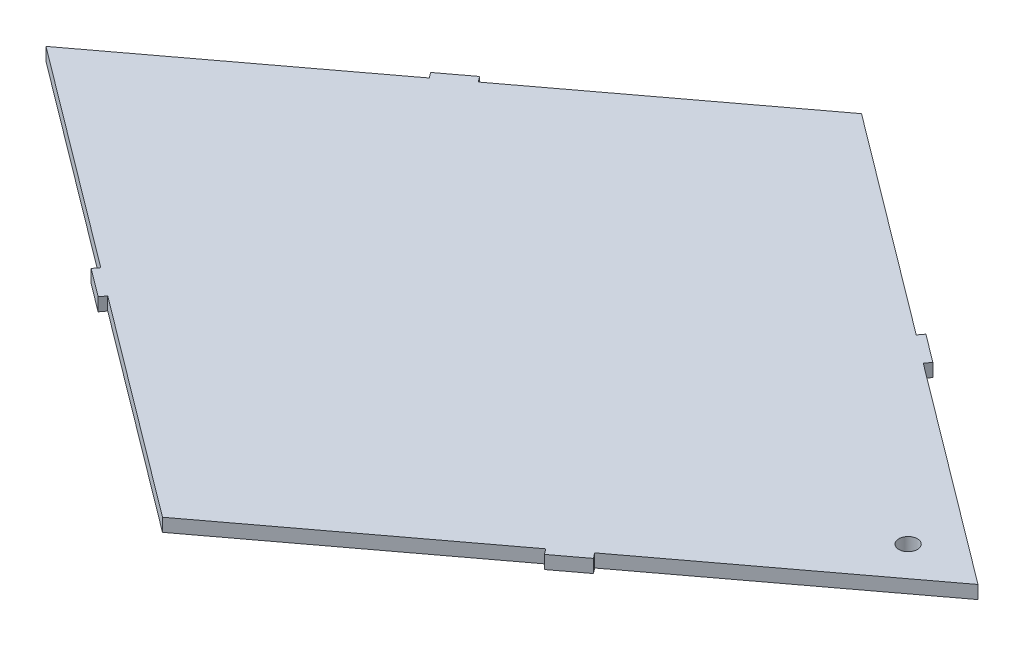
ISO-10303-21;
HEADER;
FILE_DESCRIPTION(('STEP AP214'),'2;1');
FILE_NAME('part.step','',(''),(''),'','','');
FILE_SCHEMA(('AUTOMOTIVE_DESIGN { 1 0 10303 214 1 1 1 1 }'));
ENDSEC;
DATA;
#1=APPLICATION_CONTEXT('core data for automotive mechanical design processes');
#2=APPLICATION_PROTOCOL_DEFINITION('international standard','automotive_design',2000,#1);
#3=PRODUCT_CONTEXT('',#1,'mechanical');
#4=PRODUCT('Part','Part','',(#3));
#5=PRODUCT_RELATED_PRODUCT_CATEGORY('part','',(#4));
#6=PRODUCT_DEFINITION_FORMATION('','',#4);
#7=PRODUCT_DEFINITION_CONTEXT('part definition',#1,'design');
#8=PRODUCT_DEFINITION('design','',#6,#7);
#9=PRODUCT_DEFINITION_SHAPE('','',#8);
#10=(LENGTH_UNIT() NAMED_UNIT(*) SI_UNIT(.MILLI.,.METRE.));
#11=(NAMED_UNIT(*) PLANE_ANGLE_UNIT() SI_UNIT($,.RADIAN.));
#12=(NAMED_UNIT(*) SI_UNIT($,.STERADIAN.) SOLID_ANGLE_UNIT());
#13=UNCERTAINTY_MEASURE_WITH_UNIT(LENGTH_MEASURE(1.E-05),#10,'distance_accuracy_value','');
#14=(GEOMETRIC_REPRESENTATION_CONTEXT(3) GLOBAL_UNCERTAINTY_ASSIGNED_CONTEXT((#13)) GLOBAL_UNIT_ASSIGNED_CONTEXT((#10,
#11,#12)) REPRESENTATION_CONTEXT('',''));
#15=CARTESIAN_POINT('',(0.,0.,0.));
#16=DIRECTION('',(0.,0.,1.));
#17=DIRECTION('',(1.,0.,0.));
#18=AXIS2_PLACEMENT_3D('',#15,#16,#17);
#19=CARTESIAN_POINT('',(0.,5.63,0.));
#20=DIRECTION('',(0.,1.,0.));
#21=DIRECTION('',(0.,0.,1.));
#22=AXIS2_PLACEMENT_3D('',#19,#20,#21);
#23=PLANE('',#22);
#24=DIRECTION('',(-0.8,0.,0.6));
#25=VECTOR('',#24,1.);
#26=CARTESIAN_POINT('',(-94.,5.63,-79.5));
#27=LINE('',#26,#25);
#28=CARTESIAN_POINT('',(0.,5.63,-150.));
#29=VERTEX_POINT('',#28);
#30=CARTESIAN_POINT('',(-94.,5.63,-79.5));
#31=VERTEX_POINT('',#30);
#32=EDGE_CURVE('E287',#29,#31,#27,.T.);
#33=ORIENTED_EDGE('',*,*,#32,.T.);
#34=DIRECTION('',(-0.599999999999997,0.,-0.800000000000002));
#35=VECTOR('',#34,1.);
#36=CARTESIAN_POINT('',(-95.77,5.63,-81.86));
#37=LINE('',#36,#35);
#38=CARTESIAN_POINT('',(-95.77,5.63,-81.86));
#39=VERTEX_POINT('',#38);
#40=EDGE_CURVE('E131',#31,#39,#37,.T.);
#41=ORIENTED_EDGE('',*,*,#40,.T.);
#42=DIRECTION('',(-0.8,0.,0.6));
#43=VECTOR('',#42,1.);
#44=CARTESIAN_POINT('',(-107.77,5.63,-72.86));
#45=LINE('',#44,#43);
#46=CARTESIAN_POINT('',(-107.77,5.63,-72.86));
#47=VERTEX_POINT('',#46);
#48=EDGE_CURVE('E279',#39,#47,#45,.T.);
#49=ORIENTED_EDGE('',*,*,#48,.T.);
#50=DIRECTION('',(0.599999999999986,0.,0.80000000000001));
#51=VECTOR('',#50,1.);
#52=CARTESIAN_POINT('',(-106.,5.63,-70.5));
#53=LINE('',#52,#51);
#54=CARTESIAN_POINT('',(-106.,5.63,-70.5));
#55=VERTEX_POINT('',#54);
#56=EDGE_CURVE('E275',#47,#55,#53,.T.);
#57=ORIENTED_EDGE('',*,*,#56,.T.);
#58=DIRECTION('',(-0.8,0.,0.6));
#59=VECTOR('',#58,1.);
#60=CARTESIAN_POINT('',(-200.,5.63,0.));
#61=LINE('',#60,#59);
#62=CARTESIAN_POINT('',(-200.,5.63,0.));
#63=VERTEX_POINT('',#62);
#64=EDGE_CURVE('E272',#55,#63,#61,.T.);
#65=ORIENTED_EDGE('',*,*,#64,.T.);
#66=DIRECTION('',(0.8,0.,0.6));
#67=VECTOR('',#66,1.);
#68=CARTESIAN_POINT('',(-106.,5.63,70.5));
#69=LINE('',#68,#67);
#70=CARTESIAN_POINT('',(-106.,5.63,70.5));
#71=VERTEX_POINT('',#70);
#72=EDGE_CURVE('E264',#63,#71,#69,.T.);
#73=ORIENTED_EDGE('',*,*,#72,.T.);
#74=DIRECTION('',(-0.599999999999998,0.,0.800000000000001));
#75=VECTOR('',#74,1.);
#76=CARTESIAN_POINT('',(-106.,5.63,70.5));
#77=LINE('',#76,#75);
#78=CARTESIAN_POINT('',(-107.769999999999,5.63,72.8599999999987));
#79=VERTEX_POINT('',#78);
#80=EDGE_CURVE('E260',#71,#79,#77,.T.);
#81=ORIENTED_EDGE('',*,*,#80,.T.);
#82=DIRECTION('',(0.8,0.,0.599999999999999));
#83=VECTOR('',#82,1.);
#84=CARTESIAN_POINT('',(-107.769999999999,5.63,72.8599999999987));
#85=LINE('',#84,#83);
#86=CARTESIAN_POINT('',(-95.769999999999,5.63,81.8599999999987));
#87=VERTEX_POINT('',#86);
#88=EDGE_CURVE('E256',#79,#87,#85,.T.);
#89=ORIENTED_EDGE('',*,*,#88,.T.);
#90=DIRECTION('',(0.599999999999999,0.,-0.800000000000001));
#91=VECTOR('',#90,1.);
#92=CARTESIAN_POINT('',(-95.769999999999,5.63,81.8599999999987));
#93=LINE('',#92,#91);
#94=CARTESIAN_POINT('',(-93.9999999999991,5.63,79.4999999999988));
#95=VERTEX_POINT('',#94);
#96=EDGE_CURVE('E253',#87,#95,#93,.T.);
#97=ORIENTED_EDGE('',*,*,#96,.T.);
#98=DIRECTION('',(0.799999999999992,0.,0.60000000000001));
#99=VECTOR('',#98,1.);
#100=CARTESIAN_POINT('',(0.,5.63,150.));
#101=LINE('',#100,#99);
#102=CARTESIAN_POINT('',(0.,5.63,150.));
#103=VERTEX_POINT('',#102);
#104=EDGE_CURVE('E245',#95,#103,#101,.T.);
#105=ORIENTED_EDGE('',*,*,#104,.T.);
#106=DIRECTION('',(0.8,0.,-0.6));
#107=VECTOR('',#106,1.);
#108=CARTESIAN_POINT('',(94.,5.63,79.5));
#109=LINE('',#108,#107);
#110=CARTESIAN_POINT('',(94.,5.63,79.5));
#111=VERTEX_POINT('',#110);
#112=EDGE_CURVE('E241',#103,#111,#109,.T.);
#113=ORIENTED_EDGE('',*,*,#112,.T.);
#114=DIRECTION('',(0.599999999999999,0.,0.8));
#115=VECTOR('',#114,1.);
#116=CARTESIAN_POINT('',(94.,5.63,79.5));
#117=LINE('',#116,#115);
#118=CARTESIAN_POINT('',(95.7699999999997,5.63,81.8599999999997));
#119=VERTEX_POINT('',#118);
#120=EDGE_CURVE('E237',#111,#119,#117,.T.);
#121=ORIENTED_EDGE('',*,*,#120,.T.);
#122=DIRECTION('',(0.8,0.,-0.6));
#123=VECTOR('',#122,1.);
#124=CARTESIAN_POINT('',(95.7699999999997,5.63,81.8599999999997));
#125=LINE('',#124,#123);
#126=CARTESIAN_POINT('',(107.77,5.63,72.8599999999997));
#127=VERTEX_POINT('',#126);
#128=EDGE_CURVE('E234',#119,#127,#125,.T.);
#129=ORIENTED_EDGE('',*,*,#128,.T.);
#130=DIRECTION('',(-0.600000000000006,0.,-0.799999999999995));
#131=VECTOR('',#130,1.);
#132=CARTESIAN_POINT('',(107.77,5.63,72.8599999999997));
#133=LINE('',#132,#131);
#134=CARTESIAN_POINT('',(106.,5.63,70.5000000000001));
#135=VERTEX_POINT('',#134);
#136=EDGE_CURVE('E226',#127,#135,#133,.T.);
#137=ORIENTED_EDGE('',*,*,#136,.T.);
#138=DIRECTION('',(0.8,0.,-0.600000000000001));
#139=VECTOR('',#138,1.);
#140=CARTESIAN_POINT('',(200.,5.63,0.));
#141=LINE('',#140,#139);
#142=CARTESIAN_POINT('',(200.,5.63,0.));
#143=VERTEX_POINT('',#142);
#144=EDGE_CURVE('E222',#135,#143,#141,.T.);
#145=ORIENTED_EDGE('',*,*,#144,.T.);
#146=DIRECTION('',(-0.8,0.,-0.6));
#147=VECTOR('',#146,1.);
#148=CARTESIAN_POINT('',(106.,5.63,-70.5));
#149=LINE('',#148,#147);
#150=CARTESIAN_POINT('',(106.,5.63,-70.5));
#151=VERTEX_POINT('',#150);
#152=EDGE_CURVE('E218',#143,#151,#149,.T.);
#153=ORIENTED_EDGE('',*,*,#152,.T.);
#154=DIRECTION('',(0.599999999999998,0.,-0.800000000000001));
#155=VECTOR('',#154,1.);
#156=CARTESIAN_POINT('',(107.77,5.63,-72.86));
#157=LINE('',#156,#155);
#158=CARTESIAN_POINT('',(107.77,5.63,-72.86));
#159=VERTEX_POINT('',#158);
#160=EDGE_CURVE('E186',#151,#159,#157,.T.);
#161=ORIENTED_EDGE('',*,*,#160,.T.);
#162=DIRECTION('',(-0.8,0.,-0.6));
#163=VECTOR('',#162,1.);
#164=CARTESIAN_POINT('',(95.7700000000001,5.63,-81.86));
#165=LINE('',#164,#163);
#166=CARTESIAN_POINT('',(95.7700000000001,5.63,-81.86));
#167=VERTEX_POINT('',#166);
#168=EDGE_CURVE('E180',#159,#167,#165,.T.);
#169=ORIENTED_EDGE('',*,*,#168,.T.);
#170=DIRECTION('',(-0.600000000000002,0.,0.799999999999999));
#171=VECTOR('',#170,1.);
#172=CARTESIAN_POINT('',(94.0000000000001,5.63,-79.5));
#173=LINE('',#172,#171);
#174=CARTESIAN_POINT('',(94.0000000000001,5.63,-79.5));
#175=VERTEX_POINT('',#174);
#176=EDGE_CURVE('E184',#167,#175,#173,.T.);
#177=ORIENTED_EDGE('',*,*,#176,.T.);
#178=DIRECTION('',(-0.8,0.,-0.6));
#179=VECTOR('',#178,1.);
#180=CARTESIAN_POINT('',(0.,5.63,-150.));
#181=LINE('',#180,#179);
#182=EDGE_CURVE('E52',#175,#29,#181,.T.);
#183=ORIENTED_EDGE('',*,*,#182,.T.);
#184=EDGE_LOOP('',(#33,#41,#49,#57,#65,#73,#81,#89,#97,#105,#113,#121,#129,#137,#145,#153,#161,
#169,#177,#183));
#185=FACE_BOUND('',#184,.T.);
#186=CARTESIAN_POINT('',(170.,5.63,0.));
#187=DIRECTION('',(0.,1.,0.));
#188=DIRECTION('',(0.,0.,1.));
#189=AXIS2_PLACEMENT_3D('',#186,#187,#188);
#190=CIRCLE('',#189,3.99999999999999);
#191=CARTESIAN_POINT('',(170.,5.63,4.));
#192=VERTEX_POINT('',#191);
#193=EDGE_CURVE('E293',#192,#192,#190,.T.);
#194=ORIENTED_EDGE('',*,*,#193,.F.);
#195=EDGE_LOOP('',(#194));
#196=FACE_BOUND('',#195,.T.);
#197=ADVANCED_FACE('F35',(#185,#196),#23,.T.);
#198=CARTESIAN_POINT('',(0.,0.,0.));
#199=DIRECTION('',(0.,1.,0.));
#200=DIRECTION('',(0.,0.,1.));
#201=AXIS2_PLACEMENT_3D('',#198,#199,#200);
#202=PLANE('',#201);
#203=DIRECTION('',(-0.8,0.,0.6));
#204=VECTOR('',#203,1.);
#205=CARTESIAN_POINT('',(-94.,0.,-79.5));
#206=LINE('',#205,#204);
#207=CARTESIAN_POINT('',(0.,0.,-150.));
#208=VERTEX_POINT('',#207);
#209=CARTESIAN_POINT('',(-94.,0.,-79.5));
#210=VERTEX_POINT('',#209);
#211=EDGE_CURVE('E297',#208,#210,#206,.T.);
#212=ORIENTED_EDGE('',*,*,#211,.F.);
#213=DIRECTION('',(-0.8,0.,-0.6));
#214=VECTOR('',#213,1.);
#215=CARTESIAN_POINT('',(0.,0.,-150.));
#216=LINE('',#215,#214);
#217=CARTESIAN_POINT('',(94.0000000000001,0.,-79.5));
#218=VERTEX_POINT('',#217);
#219=EDGE_CURVE('E123',#218,#208,#216,.T.);
#220=ORIENTED_EDGE('',*,*,#219,.F.);
#221=DIRECTION('',(-0.600000000000002,0.,0.799999999999999));
#222=VECTOR('',#221,1.);
#223=CARTESIAN_POINT('',(94.0000000000001,0.,-79.5));
#224=LINE('',#223,#222);
#225=CARTESIAN_POINT('',(95.7700000000001,0.,-81.86));
#226=VERTEX_POINT('',#225);
#227=EDGE_CURVE('E117',#226,#218,#224,.T.);
#228=ORIENTED_EDGE('',*,*,#227,.F.);
#229=DIRECTION('',(-0.8,0.,-0.6));
#230=VECTOR('',#229,1.);
#231=CARTESIAN_POINT('',(95.7700000000001,0.,-81.86));
#232=LINE('',#231,#230);
#233=CARTESIAN_POINT('',(107.77,0.,-72.86));
#234=VERTEX_POINT('',#233);
#235=EDGE_CURVE('E195',#234,#226,#232,.T.);
#236=ORIENTED_EDGE('',*,*,#235,.F.);
#237=DIRECTION('',(0.599999999999998,0.,-0.800000000000001));
#238=VECTOR('',#237,1.);
#239=CARTESIAN_POINT('',(107.77,0.,-72.86));
#240=LINE('',#239,#238);
#241=CARTESIAN_POINT('',(106.,0.,-70.5));
#242=VERTEX_POINT('',#241);
#243=EDGE_CURVE('E335',#242,#234,#240,.T.);
#244=ORIENTED_EDGE('',*,*,#243,.F.);
#245=DIRECTION('',(-0.8,0.,-0.6));
#246=VECTOR('',#245,1.);
#247=CARTESIAN_POINT('',(106.,0.,-70.5));
#248=LINE('',#247,#246);
#249=CARTESIAN_POINT('',(200.,0.,0.));
#250=VERTEX_POINT('',#249);
#251=EDGE_CURVE('E333',#250,#242,#248,.T.);
#252=ORIENTED_EDGE('',*,*,#251,.F.);
#253=DIRECTION('',(0.8,0.,-0.600000000000001));
#254=VECTOR('',#253,1.);
#255=CARTESIAN_POINT('',(200.,0.,0.));
#256=LINE('',#255,#254);
#257=CARTESIAN_POINT('',(106.,0.,70.5000000000001));
#258=VERTEX_POINT('',#257);
#259=EDGE_CURVE('E331',#258,#250,#256,.T.);
#260=ORIENTED_EDGE('',*,*,#259,.F.);
#261=DIRECTION('',(-0.600000000000006,0.,-0.799999999999995));
#262=VECTOR('',#261,1.);
#263=CARTESIAN_POINT('',(107.77,0.,72.8599999999997));
#264=LINE('',#263,#262);
#265=CARTESIAN_POINT('',(107.77,0.,72.8599999999997));
#266=VERTEX_POINT('',#265);
#267=EDGE_CURVE('E329',#266,#258,#264,.T.);
#268=ORIENTED_EDGE('',*,*,#267,.F.);
#269=DIRECTION('',(0.8,0.,-0.6));
#270=VECTOR('',#269,1.);
#271=CARTESIAN_POINT('',(95.7699999999997,0.,81.8599999999997));
#272=LINE('',#271,#270);
#273=CARTESIAN_POINT('',(95.7699999999997,0.,81.8599999999997));
#274=VERTEX_POINT('',#273);
#275=EDGE_CURVE('E327',#274,#266,#272,.T.);
#276=ORIENTED_EDGE('',*,*,#275,.F.);
#277=DIRECTION('',(0.599999999999999,0.,0.8));
#278=VECTOR('',#277,1.);
#279=CARTESIAN_POINT('',(94.,0.,79.5));
#280=LINE('',#279,#278);
#281=CARTESIAN_POINT('',(94.,0.,79.5));
#282=VERTEX_POINT('',#281);
#283=EDGE_CURVE('E325',#282,#274,#280,.T.);
#284=ORIENTED_EDGE('',*,*,#283,.F.);
#285=DIRECTION('',(0.8,0.,-0.6));
#286=VECTOR('',#285,1.);
#287=CARTESIAN_POINT('',(94.,0.,79.5));
#288=LINE('',#287,#286);
#289=CARTESIAN_POINT('',(0.,0.,150.));
#290=VERTEX_POINT('',#289);
#291=EDGE_CURVE('E323',#290,#282,#288,.T.);
#292=ORIENTED_EDGE('',*,*,#291,.F.);
#293=DIRECTION('',(0.799999999999992,0.,0.60000000000001));
#294=VECTOR('',#293,1.);
#295=CARTESIAN_POINT('',(0.,0.,150.));
#296=LINE('',#295,#294);
#297=CARTESIAN_POINT('',(-93.9999999999991,0.,79.4999999999988));
#298=VERTEX_POINT('',#297);
#299=EDGE_CURVE('E321',#298,#290,#296,.T.);
#300=ORIENTED_EDGE('',*,*,#299,.F.);
#301=DIRECTION('',(0.599999999999999,0.,-0.800000000000001));
#302=VECTOR('',#301,1.);
#303=CARTESIAN_POINT('',(-95.769999999999,0.,81.8599999999987));
#304=LINE('',#303,#302);
#305=CARTESIAN_POINT('',(-95.769999999999,0.,81.8599999999987));
#306=VERTEX_POINT('',#305);
#307=EDGE_CURVE('E319',#306,#298,#304,.T.);
#308=ORIENTED_EDGE('',*,*,#307,.F.);
#309=DIRECTION('',(0.8,0.,0.599999999999999));
#310=VECTOR('',#309,1.);
#311=CARTESIAN_POINT('',(-107.769999999999,0.,72.8599999999987));
#312=LINE('',#311,#310);
#313=CARTESIAN_POINT('',(-107.769999999999,0.,72.8599999999987));
#314=VERTEX_POINT('',#313);
#315=EDGE_CURVE('E317',#314,#306,#312,.T.);
#316=ORIENTED_EDGE('',*,*,#315,.F.);
#317=DIRECTION('',(-0.599999999999998,0.,0.800000000000001));
#318=VECTOR('',#317,1.);
#319=CARTESIAN_POINT('',(-106.,0.,70.5));
#320=LINE('',#319,#318);
#321=CARTESIAN_POINT('',(-106.,0.,70.5));
#322=VERTEX_POINT('',#321);
#323=EDGE_CURVE('E315',#322,#314,#320,.T.);
#324=ORIENTED_EDGE('',*,*,#323,.F.);
#325=DIRECTION('',(0.8,0.,0.6));
#326=VECTOR('',#325,1.);
#327=CARTESIAN_POINT('',(-106.,0.,70.5));
#328=LINE('',#327,#326);
#329=CARTESIAN_POINT('',(-200.,0.,0.));
#330=VERTEX_POINT('',#329);
#331=EDGE_CURVE('E313',#330,#322,#328,.T.);
#332=ORIENTED_EDGE('',*,*,#331,.F.);
#333=DIRECTION('',(-0.8,0.,0.6));
#334=VECTOR('',#333,1.);
#335=CARTESIAN_POINT('',(-200.,0.,0.));
#336=LINE('',#335,#334);
#337=CARTESIAN_POINT('',(-106.,0.,-70.5));
#338=VERTEX_POINT('',#337);
#339=EDGE_CURVE('E311',#338,#330,#336,.T.);
#340=ORIENTED_EDGE('',*,*,#339,.F.);
#341=DIRECTION('',(0.599999999999986,0.,0.80000000000001));
#342=VECTOR('',#341,1.);
#343=CARTESIAN_POINT('',(-106.,0.,-70.5));
#344=LINE('',#343,#342);
#345=CARTESIAN_POINT('',(-107.77,0.,-72.86));
#346=VERTEX_POINT('',#345);
#347=EDGE_CURVE('E309',#346,#338,#344,.T.);
#348=ORIENTED_EDGE('',*,*,#347,.F.);
#349=DIRECTION('',(-0.8,0.,0.6));
#350=VECTOR('',#349,1.);
#351=CARTESIAN_POINT('',(-107.77,0.,-72.86));
#352=LINE('',#351,#350);
#353=CARTESIAN_POINT('',(-95.77,0.,-81.86));
#354=VERTEX_POINT('',#353);
#355=EDGE_CURVE('E305',#354,#346,#352,.T.);
#356=ORIENTED_EDGE('',*,*,#355,.F.);
#357=DIRECTION('',(-0.599999999999997,0.,-0.800000000000002));
#358=VECTOR('',#357,1.);
#359=CARTESIAN_POINT('',(-95.77,0.,-81.86));
#360=LINE('',#359,#358);
#361=EDGE_CURVE('E301',#210,#354,#360,.T.);
#362=ORIENTED_EDGE('',*,*,#361,.F.);
#363=EDGE_LOOP('',(#212,#220,#228,#236,#244,#252,#260,#268,#276,#284,#292,#300,#308,#316,#324,
#332,#340,#348,#356,#362));
#364=FACE_BOUND('',#363,.T.);
#365=CARTESIAN_POINT('',(170.,0.,0.));
#366=DIRECTION('',(0.,1.,0.));
#367=DIRECTION('',(0.,0.,1.));
#368=AXIS2_PLACEMENT_3D('',#365,#366,#367);
#369=CIRCLE('',#368,3.99999999999999);
#370=CARTESIAN_POINT('',(170.,0.,4.));
#371=VERTEX_POINT('',#370);
#372=EDGE_CURVE('E291',#371,#371,#369,.T.);
#373=ORIENTED_EDGE('',*,*,#372,.T.);
#374=EDGE_LOOP('',(#373));
#375=FACE_BOUND('',#374,.T.);
#376=ADVANCED_FACE('F392',(#364,#375),#202,.F.);
#377=CARTESIAN_POINT('',(-94.,5.63,-79.5));
#378=DIRECTION('',(0.6,0.,0.8));
#379=DIRECTION('',(0.8,0.,-0.6));
#380=AXIS2_PLACEMENT_3D('',#377,#378,#379);
#381=PLANE('',#380);
#382=ORIENTED_EDGE('',*,*,#211,.T.);
#383=DIRECTION('',(0.,-1.,0.));
#384=VECTOR('',#383,1.);
#385=CARTESIAN_POINT('',(-94.,5.63,-79.5));
#386=LINE('',#385,#384);
#387=EDGE_CURVE('E12',#31,#210,#386,.T.);
#388=ORIENTED_EDGE('',*,*,#387,.F.);
#389=ORIENTED_EDGE('',*,*,#32,.F.);
#390=DIRECTION('',(0.,-1.,0.));
#391=VECTOR('',#390,1.);
#392=CARTESIAN_POINT('',(0.,5.63,-150.));
#393=LINE('',#392,#391);
#394=EDGE_CURVE('E203',#29,#208,#393,.T.);
#395=ORIENTED_EDGE('',*,*,#394,.T.);
#396=EDGE_LOOP('',(#382,#388,#389,#395));
#397=FACE_BOUND('',#396,.T.);
#398=ADVANCED_FACE('F37',(#397),#381,.F.);
#399=CARTESIAN_POINT('',(-95.77,5.63,-81.86));
#400=DIRECTION('',(-0.800000000000002,0.,0.599999999999997));
#401=DIRECTION('',(0.599999999999997,0.,0.800000000000002));
#402=AXIS2_PLACEMENT_3D('',#399,#400,#401);
#403=PLANE('',#402);
#404=ORIENTED_EDGE('',*,*,#361,.T.);
#405=DIRECTION('',(0.,-1.,0.));
#406=VECTOR('',#405,1.);
#407=CARTESIAN_POINT('',(-95.77,5.63,-81.86));
#408=LINE('',#407,#406);
#409=EDGE_CURVE('E44',#39,#354,#408,.T.);
#410=ORIENTED_EDGE('',*,*,#409,.F.);
#411=ORIENTED_EDGE('',*,*,#40,.F.);
#412=ORIENTED_EDGE('',*,*,#387,.T.);
#413=EDGE_LOOP('',(#404,#410,#411,#412));
#414=FACE_BOUND('',#413,.T.);
#415=ADVANCED_FACE('F622',(#414),#403,.F.);
#416=CARTESIAN_POINT('',(-107.77,5.63,-72.86));
#417=DIRECTION('',(0.6,0.,0.8));
#418=DIRECTION('',(0.8,0.,-0.6));
#419=AXIS2_PLACEMENT_3D('',#416,#417,#418);
#420=PLANE('',#419);
#421=ORIENTED_EDGE('',*,*,#355,.T.);
#422=DIRECTION('',(0.,-1.,0.));
#423=VECTOR('',#422,1.);
#424=CARTESIAN_POINT('',(-107.77,5.63,-72.86));
#425=LINE('',#424,#423);
#426=EDGE_CURVE('E382',#47,#346,#425,.T.);
#427=ORIENTED_EDGE('',*,*,#426,.F.);
#428=ORIENTED_EDGE('',*,*,#48,.F.);
#429=ORIENTED_EDGE('',*,*,#409,.T.);
#430=EDGE_LOOP('',(#421,#427,#428,#429));
#431=FACE_BOUND('',#430,.T.);
#432=ADVANCED_FACE('F388',(#431),#420,.F.);
#433=CARTESIAN_POINT('',(-106.,5.63,-70.5));
#434=DIRECTION('',(0.80000000000001,0.,-0.599999999999986));
#435=DIRECTION('',(-0.599999999999986,0.,-0.80000000000001));
#436=AXIS2_PLACEMENT_3D('',#433,#434,#435);
#437=PLANE('',#436);
#438=ORIENTED_EDGE('',*,*,#347,.T.);
#439=DIRECTION('',(0.,-1.,0.));
#440=VECTOR('',#439,1.);
#441=CARTESIAN_POINT('',(-106.,5.63,-70.5));
#442=LINE('',#441,#440);
#443=EDGE_CURVE('E379',#55,#338,#442,.T.);
#444=ORIENTED_EDGE('',*,*,#443,.F.);
#445=ORIENTED_EDGE('',*,*,#56,.F.);
#446=ORIENTED_EDGE('',*,*,#426,.T.);
#447=EDGE_LOOP('',(#438,#444,#445,#446));
#448=FACE_BOUND('',#447,.T.);
#449=ADVANCED_FACE('F398',(#448),#437,.F.);
#450=CARTESIAN_POINT('',(-200.,5.63,0.));
#451=DIRECTION('',(0.6,0.,0.8));
#452=DIRECTION('',(0.8,0.,-0.6));
#453=AXIS2_PLACEMENT_3D('',#450,#451,#452);
#454=PLANE('',#453);
#455=ORIENTED_EDGE('',*,*,#339,.T.);
#456=DIRECTION('',(0.,-1.,0.));
#457=VECTOR('',#456,1.);
#458=CARTESIAN_POINT('',(-200.,5.63,0.));
#459=LINE('',#458,#457);
#460=EDGE_CURVE('E376',#63,#330,#459,.T.);
#461=ORIENTED_EDGE('',*,*,#460,.F.);
#462=ORIENTED_EDGE('',*,*,#64,.F.);
#463=ORIENTED_EDGE('',*,*,#443,.T.);
#464=EDGE_LOOP('',(#455,#461,#462,#463));
#465=FACE_BOUND('',#464,.T.);
#466=ADVANCED_FACE('F402',(#465),#454,.F.);
#467=CARTESIAN_POINT('',(-106.,5.63,70.5));
#468=DIRECTION('',(0.6,0.,-0.8));
#469=DIRECTION('',(-0.8,0.,-0.6));
#470=AXIS2_PLACEMENT_3D('',#467,#468,#469);
#471=PLANE('',#470);
#472=ORIENTED_EDGE('',*,*,#331,.T.);
#473=DIRECTION('',(0.,-1.,0.));
#474=VECTOR('',#473,1.);
#475=CARTESIAN_POINT('',(-106.,5.63,70.5));
#476=LINE('',#475,#474);
#477=EDGE_CURVE('E373',#71,#322,#476,.T.);
#478=ORIENTED_EDGE('',*,*,#477,.F.);
#479=ORIENTED_EDGE('',*,*,#72,.F.);
#480=ORIENTED_EDGE('',*,*,#460,.T.);
#481=EDGE_LOOP('',(#472,#478,#479,#480));
#482=FACE_BOUND('',#481,.T.);
#483=ADVANCED_FACE('F465',(#482),#471,.F.);
#484=CARTESIAN_POINT('',(-106.,5.63,70.5));
#485=DIRECTION('',(0.800000000000001,0.,0.599999999999999));
#486=DIRECTION('',(0.599999999999999,0.,-0.800000000000001));
#487=AXIS2_PLACEMENT_3D('',#484,#485,#486);
#488=PLANE('',#487);
#489=ORIENTED_EDGE('',*,*,#323,.T.);
#490=DIRECTION('',(0.,-1.,0.));
#491=VECTOR('',#490,1.);
#492=CARTESIAN_POINT('',(-107.769999999999,5.63,72.8599999999987));
#493=LINE('',#492,#491);
#494=EDGE_CURVE('E370',#79,#314,#493,.T.);
#495=ORIENTED_EDGE('',*,*,#494,.F.);
#496=ORIENTED_EDGE('',*,*,#80,.F.);
#497=ORIENTED_EDGE('',*,*,#477,.T.);
#498=EDGE_LOOP('',(#489,#495,#496,#497));
#499=FACE_BOUND('',#498,.T.);
#500=ADVANCED_FACE('F462',(#499),#488,.F.);
#501=CARTESIAN_POINT('',(-107.769999999999,5.63,72.8599999999987));
#502=DIRECTION('',(0.599999999999999,0.,-0.8));
#503=DIRECTION('',(-0.800000000000001,0.,-0.6));
#504=AXIS2_PLACEMENT_3D('',#501,#502,#503);
#505=PLANE('',#504);
#506=ORIENTED_EDGE('',*,*,#315,.T.);
#507=DIRECTION('',(0.,-1.,0.));
#508=VECTOR('',#507,1.);
#509=CARTESIAN_POINT('',(-95.769999999999,5.63,81.8599999999987));
#510=LINE('',#509,#508);
#511=EDGE_CURVE('E367',#87,#306,#510,.T.);
#512=ORIENTED_EDGE('',*,*,#511,.F.);
#513=ORIENTED_EDGE('',*,*,#88,.F.);
#514=ORIENTED_EDGE('',*,*,#494,.T.);
#515=EDGE_LOOP('',(#506,#512,#513,#514));
#516=FACE_BOUND('',#515,.T.);
#517=ADVANCED_FACE('F458',(#516),#505,.F.);
#518=CARTESIAN_POINT('',(-95.769999999999,5.63,81.8599999999987));
#519=DIRECTION('',(-0.800000000000001,0.,-0.599999999999999));
#520=DIRECTION('',(-0.599999999999999,0.,0.800000000000001));
#521=AXIS2_PLACEMENT_3D('',#518,#519,#520);
#522=PLANE('',#521);
#523=ORIENTED_EDGE('',*,*,#307,.T.);
#524=DIRECTION('',(0.,-1.,0.));
#525=VECTOR('',#524,1.);
#526=CARTESIAN_POINT('',(-93.9999999999991,5.63,79.4999999999988));
#527=LINE('',#526,#525);
#528=EDGE_CURVE('E364',#95,#298,#527,.T.);
#529=ORIENTED_EDGE('',*,*,#528,.F.);
#530=ORIENTED_EDGE('',*,*,#96,.F.);
#531=ORIENTED_EDGE('',*,*,#511,.T.);
#532=EDGE_LOOP('',(#523,#529,#530,#531));
#533=FACE_BOUND('',#532,.T.);
#534=ADVANCED_FACE('F454',(#533),#522,.F.);
#535=CARTESIAN_POINT('',(0.,5.63,150.));
#536=DIRECTION('',(0.60000000000001,0.,-0.799999999999992));
#537=DIRECTION('',(-0.799999999999993,0.,-0.60000000000001));
#538=AXIS2_PLACEMENT_3D('',#535,#536,#537);
#539=PLANE('',#538);
#540=ORIENTED_EDGE('',*,*,#299,.T.);
#541=DIRECTION('',(0.,-1.,0.));
#542=VECTOR('',#541,1.);
#543=CARTESIAN_POINT('',(0.,5.63,150.));
#544=LINE('',#543,#542);
#545=EDGE_CURVE('E361',#103,#290,#544,.T.);
#546=ORIENTED_EDGE('',*,*,#545,.F.);
#547=ORIENTED_EDGE('',*,*,#104,.F.);
#548=ORIENTED_EDGE('',*,*,#528,.T.);
#549=EDGE_LOOP('',(#540,#546,#547,#548));
#550=FACE_BOUND('',#549,.T.);
#551=ADVANCED_FACE('F449',(#550),#539,.F.);
#552=CARTESIAN_POINT('',(94.,5.63,79.5));
#553=DIRECTION('',(-0.6,0.,-0.8));
#554=DIRECTION('',(-0.8,0.,0.6));
#555=AXIS2_PLACEMENT_3D('',#552,#553,#554);
#556=PLANE('',#555);
#557=ORIENTED_EDGE('',*,*,#291,.T.);
#558=DIRECTION('',(0.,-1.,0.));
#559=VECTOR('',#558,1.);
#560=CARTESIAN_POINT('',(94.,5.63,79.5));
#561=LINE('',#560,#559);
#562=EDGE_CURVE('E358',#111,#282,#561,.T.);
#563=ORIENTED_EDGE('',*,*,#562,.F.);
#564=ORIENTED_EDGE('',*,*,#112,.F.);
#565=ORIENTED_EDGE('',*,*,#545,.T.);
#566=EDGE_LOOP('',(#557,#563,#564,#565));
#567=FACE_BOUND('',#566,.T.);
#568=ADVANCED_FACE('F443',(#567),#556,.F.);
#569=CARTESIAN_POINT('',(94.,5.63,79.5));
#570=DIRECTION('',(0.800000000000001,0.,-0.599999999999999));
#571=DIRECTION('',(-0.599999999999999,0.,-0.800000000000001));
#572=AXIS2_PLACEMENT_3D('',#569,#570,#571);
#573=PLANE('',#572);
#574=ORIENTED_EDGE('',*,*,#283,.T.);
#575=DIRECTION('',(0.,-1.,0.));
#576=VECTOR('',#575,1.);
#577=CARTESIAN_POINT('',(95.7699999999997,5.63,81.8599999999997));
#578=LINE('',#577,#576);
#579=EDGE_CURVE('E355',#119,#274,#578,.T.);
#580=ORIENTED_EDGE('',*,*,#579,.F.);
#581=ORIENTED_EDGE('',*,*,#120,.F.);
#582=ORIENTED_EDGE('',*,*,#562,.T.);
#583=EDGE_LOOP('',(#574,#580,#581,#582));
#584=FACE_BOUND('',#583,.T.);
#585=ADVANCED_FACE('F439',(#584),#573,.F.);
#586=CARTESIAN_POINT('',(95.7699999999997,5.63,81.8599999999997));
#587=DIRECTION('',(-0.6,0.,-0.8));
#588=DIRECTION('',(-0.8,0.,0.6));
#589=AXIS2_PLACEMENT_3D('',#586,#587,#588);
#590=PLANE('',#589);
#591=ORIENTED_EDGE('',*,*,#275,.T.);
#592=DIRECTION('',(0.,-1.,0.));
#593=VECTOR('',#592,1.);
#594=CARTESIAN_POINT('',(107.77,5.63,72.8599999999997));
#595=LINE('',#594,#593);
#596=EDGE_CURVE('E352',#127,#266,#595,.T.);
#597=ORIENTED_EDGE('',*,*,#596,.F.);
#598=ORIENTED_EDGE('',*,*,#128,.F.);
#599=ORIENTED_EDGE('',*,*,#579,.T.);
#600=EDGE_LOOP('',(#591,#597,#598,#599));
#601=FACE_BOUND('',#600,.T.);
#602=ADVANCED_FACE('F435',(#601),#590,.F.);
#603=CARTESIAN_POINT('',(107.77,5.63,72.8599999999997));
#604=DIRECTION('',(-0.799999999999995,0.,0.600000000000006));
#605=DIRECTION('',(0.600000000000006,0.,0.799999999999995));
#606=AXIS2_PLACEMENT_3D('',#603,#604,#605);
#607=PLANE('',#606);
#608=ORIENTED_EDGE('',*,*,#267,.T.);
#609=DIRECTION('',(0.,-1.,0.));
#610=VECTOR('',#609,1.);
#611=CARTESIAN_POINT('',(106.,5.63,70.5000000000001));
#612=LINE('',#611,#610);
#613=EDGE_CURVE('E349',#135,#258,#612,.T.);
#614=ORIENTED_EDGE('',*,*,#613,.F.);
#615=ORIENTED_EDGE('',*,*,#136,.F.);
#616=ORIENTED_EDGE('',*,*,#596,.T.);
#617=EDGE_LOOP('',(#608,#614,#615,#616));
#618=FACE_BOUND('',#617,.T.);
#619=ADVANCED_FACE('F418',(#618),#607,.F.);
#620=CARTESIAN_POINT('',(200.,5.63,0.));
#621=DIRECTION('',(-0.600000000000001,0.,-0.8));
#622=DIRECTION('',(-0.8,0.,0.600000000000001));
#623=AXIS2_PLACEMENT_3D('',#620,#621,#622);
#624=PLANE('',#623);
#625=ORIENTED_EDGE('',*,*,#259,.T.);
#626=DIRECTION('',(0.,-1.,0.));
#627=VECTOR('',#626,1.);
#628=CARTESIAN_POINT('',(200.,5.63,0.));
#629=LINE('',#628,#627);
#630=EDGE_CURVE('E346',#143,#250,#629,.T.);
#631=ORIENTED_EDGE('',*,*,#630,.F.);
#632=ORIENTED_EDGE('',*,*,#144,.F.);
#633=ORIENTED_EDGE('',*,*,#613,.T.);
#634=EDGE_LOOP('',(#625,#631,#632,#633));
#635=FACE_BOUND('',#634,.T.);
#636=ADVANCED_FACE('F422',(#635),#624,.F.);
#637=CARTESIAN_POINT('',(106.,5.63,-70.5));
#638=DIRECTION('',(-0.6,0.,0.8));
#639=DIRECTION('',(0.8,0.,0.6));
#640=AXIS2_PLACEMENT_3D('',#637,#638,#639);
#641=PLANE('',#640);
#642=ORIENTED_EDGE('',*,*,#251,.T.);
#643=DIRECTION('',(0.,-1.,0.));
#644=VECTOR('',#643,1.);
#645=CARTESIAN_POINT('',(106.,5.63,-70.5));
#646=LINE('',#645,#644);
#647=EDGE_CURVE('E343',#151,#242,#646,.T.);
#648=ORIENTED_EDGE('',*,*,#647,.F.);
#649=ORIENTED_EDGE('',*,*,#152,.F.);
#650=ORIENTED_EDGE('',*,*,#630,.T.);
#651=EDGE_LOOP('',(#642,#648,#649,#650));
#652=FACE_BOUND('',#651,.T.);
#653=ADVANCED_FACE('F427',(#652),#641,.F.);
#654=CARTESIAN_POINT('',(107.77,5.63,-72.86));
#655=DIRECTION('',(-0.800000000000001,0.,-0.599999999999999));
#656=DIRECTION('',(-0.599999999999999,0.,0.800000000000001));
#657=AXIS2_PLACEMENT_3D('',#654,#655,#656);
#658=PLANE('',#657);
#659=ORIENTED_EDGE('',*,*,#243,.T.);
#660=DIRECTION('',(0.,-1.,0.));
#661=VECTOR('',#660,1.);
#662=CARTESIAN_POINT('',(107.77,5.63,-72.86));
#663=LINE('',#662,#661);
#664=EDGE_CURVE('E196',#159,#234,#663,.T.);
#665=ORIENTED_EDGE('',*,*,#664,.F.);
#666=ORIENTED_EDGE('',*,*,#160,.F.);
#667=ORIENTED_EDGE('',*,*,#647,.T.);
#668=EDGE_LOOP('',(#659,#665,#666,#667));
#669=FACE_BOUND('',#668,.T.);
#670=ADVANCED_FACE('F430',(#669),#658,.F.);
#671=CARTESIAN_POINT('',(95.7700000000001,5.63,-81.86));
#672=DIRECTION('',(-0.6,0.,0.8));
#673=DIRECTION('',(0.8,0.,0.6));
#674=AXIS2_PLACEMENT_3D('',#671,#672,#673);
#675=PLANE('',#674);
#676=ORIENTED_EDGE('',*,*,#235,.T.);
#677=DIRECTION('',(0.,-1.,0.));
#678=VECTOR('',#677,1.);
#679=CARTESIAN_POINT('',(95.7700000000001,5.63,-81.86));
#680=LINE('',#679,#678);
#681=EDGE_CURVE('E192',#167,#226,#680,.T.);
#682=ORIENTED_EDGE('',*,*,#681,.F.);
#683=ORIENTED_EDGE('',*,*,#168,.F.);
#684=ORIENTED_EDGE('',*,*,#664,.T.);
#685=EDGE_LOOP('',(#676,#682,#683,#684));
#686=FACE_BOUND('',#685,.T.);
#687=ADVANCED_FACE('F193',(#686),#675,.F.);
#688=CARTESIAN_POINT('',(94.0000000000001,5.63,-79.5));
#689=DIRECTION('',(0.799999999999999,0.,0.600000000000002));
#690=DIRECTION('',(0.600000000000002,0.,-0.799999999999999));
#691=AXIS2_PLACEMENT_3D('',#688,#689,#690);
#692=PLANE('',#691);
#693=ORIENTED_EDGE('',*,*,#227,.T.);
#694=DIRECTION('',(0.,-1.,0.));
#695=VECTOR('',#694,1.);
#696=CARTESIAN_POINT('',(94.0000000000001,5.63,-79.5));
#697=LINE('',#696,#695);
#698=EDGE_CURVE('E197',#175,#218,#697,.T.);
#699=ORIENTED_EDGE('',*,*,#698,.F.);
#700=ORIENTED_EDGE('',*,*,#176,.F.);
#701=ORIENTED_EDGE('',*,*,#681,.T.);
#702=EDGE_LOOP('',(#693,#699,#700,#701));
#703=FACE_BOUND('',#702,.T.);
#704=ADVANCED_FACE('F199',(#703),#692,.F.);
#705=CARTESIAN_POINT('',(0.,5.63,-150.));
#706=DIRECTION('',(-0.6,0.,0.8));
#707=DIRECTION('',(0.8,0.,0.6));
#708=AXIS2_PLACEMENT_3D('',#705,#706,#707);
#709=PLANE('',#708);
#710=ORIENTED_EDGE('',*,*,#219,.T.);
#711=ORIENTED_EDGE('',*,*,#394,.F.);
#712=ORIENTED_EDGE('',*,*,#182,.F.);
#713=ORIENTED_EDGE('',*,*,#698,.T.);
#714=EDGE_LOOP('',(#710,#711,#712,#713));
#715=FACE_BOUND('',#714,.T.);
#716=ADVANCED_FACE('F483',(#715),#709,.F.);
#717=CARTESIAN_POINT('',(170.,5.63,0.));
#718=DIRECTION('',(0.,-1.,0.));
#719=DIRECTION('',(0.,0.,-1.));
#720=AXIS2_PLACEMENT_3D('',#717,#718,#719);
#721=CYLINDRICAL_SURFACE('',#720,3.99999999999999);
#722=ORIENTED_EDGE('',*,*,#193,.T.);
#723=EDGE_LOOP('',(#722));
#724=FACE_BOUND('',#723,.T.);
#725=ORIENTED_EDGE('',*,*,#372,.F.);
#726=EDGE_LOOP('',(#725));
#727=FACE_BOUND('',#726,.T.);
#728=ADVANCED_FACE('F481',(#724,#727),#721,.F.);
#729=CLOSED_SHELL('',(#197,#376,#398,#415,#432,#449,#466,#483,#500,#517,#534,#551,#568,#585,
#602,#619,#636,#653,#670,#687,#704,#716,#728));
#730=MANIFOLD_SOLID_BREP('B2',#729);
#731=ADVANCED_BREP_SHAPE_REPRESENTATION('',(#18,#730),#14);
#732=SHAPE_DEFINITION_REPRESENTATION(#9,#731);
ENDSEC;
END-ISO-10303-21;
